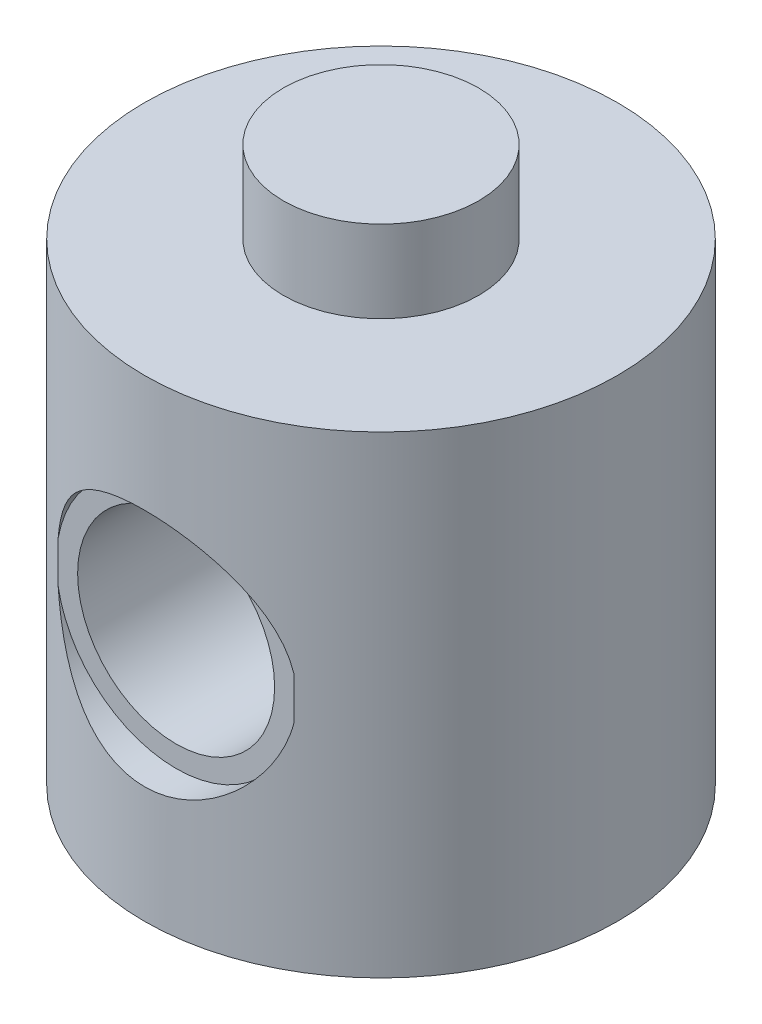
ISO-10303-21;
HEADER;
FILE_DESCRIPTION(('STEP AP214'),'2;1');
FILE_NAME('part.step','',(''),(''),'','','');
FILE_SCHEMA(('AUTOMOTIVE_DESIGN { 1 0 10303 214 1 1 1 1 }'));
ENDSEC;
DATA;
#1=APPLICATION_CONTEXT('core data for automotive mechanical design processes');
#2=APPLICATION_PROTOCOL_DEFINITION('international standard','automotive_design',2000,#1);
#3=PRODUCT_CONTEXT('',#1,'mechanical');
#4=PRODUCT('Part','Part','',(#3));
#5=PRODUCT_RELATED_PRODUCT_CATEGORY('part','',(#4));
#6=PRODUCT_DEFINITION_FORMATION('','',#4);
#7=PRODUCT_DEFINITION_CONTEXT('part definition',#1,'design');
#8=PRODUCT_DEFINITION('design','',#6,#7);
#9=PRODUCT_DEFINITION_SHAPE('','',#8);
#10=(LENGTH_UNIT() NAMED_UNIT(*) SI_UNIT(.MILLI.,.METRE.));
#11=(NAMED_UNIT(*) PLANE_ANGLE_UNIT() SI_UNIT($,.RADIAN.));
#12=(NAMED_UNIT(*) SI_UNIT($,.STERADIAN.) SOLID_ANGLE_UNIT());
#13=UNCERTAINTY_MEASURE_WITH_UNIT(LENGTH_MEASURE(1.E-05),#10,'distance_accuracy_value','');
#14=(GEOMETRIC_REPRESENTATION_CONTEXT(3) GLOBAL_UNCERTAINTY_ASSIGNED_CONTEXT((#13)) GLOBAL_UNIT_ASSIGNED_CONTEXT((#10,
#11,#12)) REPRESENTATION_CONTEXT('',''));
#15=CARTESIAN_POINT('',(0.,0.,0.));
#16=DIRECTION('',(0.,0.,1.));
#17=DIRECTION('',(1.,0.,0.));
#18=AXIS2_PLACEMENT_3D('',#15,#16,#17);
#19=CARTESIAN_POINT('',(0.,0.,0.));
#20=DIRECTION('',(0.,1.,0.));
#21=DIRECTION('',(0.,0.,1.));
#22=AXIS2_PLACEMENT_3D('',#19,#20,#21);
#23=PLANE('',#22);
#24=CARTESIAN_POINT('',(0.,0.,0.));
#25=DIRECTION('',(0.,-1.,0.));
#26=DIRECTION('',(0.,0.,-1.));
#27=AXIS2_PLACEMENT_3D('',#24,#25,#26);
#28=CIRCLE('',#27,3.937);
#29=CARTESIAN_POINT('',(0.,0.,-3.937));
#30=VERTEX_POINT('',#29);
#31=EDGE_CURVE('E97',#30,#30,#28,.T.);
#32=ORIENTED_EDGE('',*,*,#31,.F.);
#33=EDGE_LOOP('',(#32));
#34=FACE_BOUND('',#33,.T.);
#35=ADVANCED_FACE('F35',(#34),#23,.T.);
#36=CARTESIAN_POINT('',(0.,-25.654,0.));
#37=DIRECTION('',(0.,-1.,0.));
#38=DIRECTION('',(0.,0.,-1.));
#39=AXIS2_PLACEMENT_3D('',#36,#37,#38);
#40=CYLINDRICAL_SURFACE('',#39,3.937);
#41=ORIENTED_EDGE('',*,*,#31,.T.);
#42=EDGE_LOOP('',(#41));
#43=FACE_BOUND('',#42,.T.);
#44=CARTESIAN_POINT('',(0.,-3.302,0.));
#45=DIRECTION('',(0.,-1.,0.));
#46=DIRECTION('',(0.,0.,-1.));
#47=AXIS2_PLACEMENT_3D('',#44,#45,#46);
#48=CIRCLE('',#47,3.937);
#49=CARTESIAN_POINT('',(0.,-3.302,-3.937));
#50=VERTEX_POINT('',#49);
#51=EDGE_CURVE('E94',#50,#50,#48,.T.);
#52=ORIENTED_EDGE('',*,*,#51,.F.);
#53=EDGE_LOOP('',(#52));
#54=FACE_BOUND('',#53,.T.);
#55=ADVANCED_FACE('F134',(#43,#54),#40,.T.);
#56=CARTESIAN_POINT('',(3.937,-3.302,0.));
#57=DIRECTION('',(0.,1.,0.));
#58=DIRECTION('',(0.,0.,1.));
#59=AXIS2_PLACEMENT_3D('',#56,#57,#58);
#60=PLANE('',#59);
#61=ORIENTED_EDGE('',*,*,#51,.T.);
#62=EDGE_LOOP('',(#61));
#63=FACE_BOUND('',#62,.T.);
#64=CARTESIAN_POINT('',(0.,-3.30199999999999,0.));
#65=DIRECTION('',(0.,-1.,0.));
#66=DIRECTION('',(0.,0.,-1.));
#67=AXIS2_PLACEMENT_3D('',#64,#65,#66);
#68=CIRCLE('',#67,9.525);
#69=CARTESIAN_POINT('',(0.,-3.30199999999999,-9.525));
#70=VERTEX_POINT('',#69);
#71=EDGE_CURVE('E91',#70,#70,#68,.T.);
#72=ORIENTED_EDGE('',*,*,#71,.F.);
#73=EDGE_LOOP('',(#72));
#74=FACE_BOUND('',#73,.T.);
#75=ADVANCED_FACE('F130',(#63,#74),#60,.T.);
#76=CARTESIAN_POINT('',(0.,-25.654,0.));
#77=DIRECTION('',(0.,-1.,0.));
#78=DIRECTION('',(0.,0.,-1.));
#79=AXIS2_PLACEMENT_3D('',#76,#77,#78);
#80=CYLINDRICAL_SURFACE('',#79,9.525);
#81=CARTESIAN_POINT('',(0.,-8.85825,-9.525));
#82=CARTESIAN_POINT('',(0.10633970411079,-8.85825075579918,-9.52499940431026));
#83=CARTESIAN_POINT('',(0.212715681361909,-8.86252998663664,-9.52321418687749));
#84=CARTESIAN_POINT('',(0.424708606879246,-8.87960572355877,-9.51611852971387));
#85=CARTESIAN_POINT('',(0.530325032060798,-8.89240761932245,-9.51080585924981));
#86=CARTESIAN_POINT('',(0.74019608530889,-8.92643556289711,-9.49677884054498));
#87=CARTESIAN_POINT('',(0.844447466681659,-8.9476788784387,-9.48805752018966));
#88=CARTESIAN_POINT('',(1.05063078746721,-8.99836518775707,-9.46744770745331));
#89=CARTESIAN_POINT('',(1.15256176045451,-9.02781153278659,-9.45555792071836));
#90=CARTESIAN_POINT('',(1.45304856102099,-9.12781375637483,-9.41566954873609));
#91=CARTESIAN_POINT('',(1.64725042578752,-9.21018971375427,-9.38338421186795));
#92=CARTESIAN_POINT('',(2.01878960760281,-9.4036358094224,-9.31053593336086));
#93=CARTESIAN_POINT('',(2.1961320108023,-9.51469725607151,-9.2699754998386));
#94=CARTESIAN_POINT('',(2.53824093920422,-9.76829760976836,-9.18234884286996));
#95=CARTESIAN_POINT('',(2.70205730367417,-9.91204683134421,-9.13506952420801));
#96=CARTESIAN_POINT('',(3.00405615198817,-10.224329081658,-9.04026456603983));
#97=CARTESIAN_POINT('',(3.14222513903647,-10.3928750764095,-8.99273881029334));
#98=CARTESIAN_POINT('',(3.39579467666476,-10.7602021391387,-8.9001883806779));
#99=CARTESIAN_POINT('',(3.50974047292495,-10.9600628172753,-8.85540182052122));
#100=CARTESIAN_POINT('',(3.65386256626164,-11.2734408877733,-8.79645372122563));
#101=CARTESIAN_POINT('',(3.69744892615389,-11.3802090358061,-8.7781707903278));
#102=CARTESIAN_POINT('',(3.77528941119493,-11.5975831962278,-8.74497623698359));
#103=CARTESIAN_POINT('',(3.80954833407463,-11.708187202443,-8.73006288201086));
#104=CARTESIAN_POINT('',(3.86694170240057,-11.9270416665505,-8.70478736192303));
#105=CARTESIAN_POINT('',(3.89052895323577,-12.0351526105931,-8.6942419907478));
#106=CARTESIAN_POINT('',(3.92861373354644,-12.2532288849286,-8.67709957077971));
#107=CARTESIAN_POINT('',(3.94311546377091,-12.3631933340546,-8.67050069736239));
#108=CARTESIAN_POINT('',(3.9628609387512,-12.5840935887695,-8.66149391151972));
#109=CARTESIAN_POINT('',(3.96810707162349,-12.6950291363707,-8.6590849180296));
#110=CARTESIAN_POINT('',(3.96928172781074,-12.9169554305756,-8.65854653232213));
#111=CARTESIAN_POINT('',(3.96521074158956,-13.0279461739662,-8.6604169148335));
#112=CARTESIAN_POINT('',(3.94847322291751,-13.2405337470504,-8.66805984388474));
#113=CARTESIAN_POINT('',(3.93649226790049,-13.3421961914464,-8.67352102353332));
#114=CARTESIAN_POINT('',(3.90477208316463,-13.5440698663892,-8.68784624326788));
#115=CARTESIAN_POINT('',(3.8850303162509,-13.6442806112205,-8.69671139617201));
#116=CARTESIAN_POINT('',(3.81443477338007,-13.941666939379,-8.72802607625492));
#117=CARTESIAN_POINT('',(3.75219655480152,-14.1357725253334,-8.75520186013044));
#118=CARTESIAN_POINT('',(3.59796791715169,-14.5147272003309,-8.81971157431981));
#119=CARTESIAN_POINT('',(3.50537257326443,-14.6992914243909,-8.85724935772168));
#120=CARTESIAN_POINT('',(3.29346810049256,-15.0510083387365,-8.93820695787082));
#121=CARTESIAN_POINT('',(3.17414843672174,-15.2181541243908,-8.98162909159069));
#122=CARTESIAN_POINT('',(2.90034934429311,-15.5451199217075,-9.07392703271809));
#123=CARTESIAN_POINT('',(2.74375071631135,-15.7031270360366,-9.12295360910874));
#124=CARTESIAN_POINT('',(2.40579154448283,-15.9912471871474,-9.21784011680502));
#125=CARTESIAN_POINT('',(2.22442521639882,-16.1213536897357,-9.26369930462193));
#126=CARTESIAN_POINT('',(1.83657221137101,-16.3526339296476,-9.34841550416938));
#127=CARTESIAN_POINT('',(1.62960234239378,-16.4530705390501,-9.38708646308533));
#128=CARTESIAN_POINT('',(1.1996813848965,-16.6170645675717,-9.45164103458571));
#129=CARTESIAN_POINT('',(0.97673920525985,-16.6806423682592,-9.47753171301731));
#130=CARTESIAN_POINT('',(0.536346758201596,-16.765320787332,-9.51228860774907));
#131=CARTESIAN_POINT('',(0.319440830312391,-16.7888534506816,-9.52212792826799));
#132=CARTESIAN_POINT('',(-0.115426030752912,-16.800024256678,-9.52677959918588));
#133=CARTESIAN_POINT('',(-0.33338664309293,-16.7876727046877,-9.52159626384832));
#134=CARTESIAN_POINT('',(-0.752786919544944,-16.7291668065603,-9.4974161606133));
#135=CARTESIAN_POINT('',(-0.954509669108727,-16.6847203959607,-9.4791176712683));
#136=CARTESIAN_POINT('',(-1.34741522795452,-16.5656634821137,-9.43129326502253));
#137=CARTESIAN_POINT('',(-1.53859670219197,-16.4910491680502,-9.40176592971954));
#138=CARTESIAN_POINT('',(-1.91169607458844,-16.3113371521734,-9.33317509298509));
#139=CARTESIAN_POINT('',(-2.09314172700115,-16.2053645185194,-9.29384385415236));
#140=CARTESIAN_POINT('',(-2.43632423654929,-15.9669055255033,-9.20984329538344));
#141=CARTESIAN_POINT('',(-2.59805281957313,-15.8344080964218,-9.16517174989766));
#142=CARTESIAN_POINT('',(-2.90935864105438,-15.5355822343309,-9.07135879069044));
#143=CARTESIAN_POINT('',(-3.05724146582753,-15.3675127528885,-9.02212608805477));
#144=CARTESIAN_POINT('',(-3.32317676164348,-15.0081574490353,-8.92760269234456));
#145=CARTESIAN_POINT('',(-3.44122245828601,-14.8168663688213,-8.88231289601852));
#146=CARTESIAN_POINT('',(-3.64540673564474,-14.4125499929158,-8.80050901339689));
#147=CARTESIAN_POINT('',(-3.73106690034734,-14.199253935366,-8.76412911168939));
#148=CARTESIAN_POINT('',(-3.86452789664723,-13.7592733665258,-8.70611529160776));
#149=CARTESIAN_POINT('',(-3.91235994567535,-13.5326000611061,-8.68446921628956));
#150=CARTESIAN_POINT('',(-3.965704538383,-13.0911006235899,-8.66023047600162));
#151=CARTESIAN_POINT('',(-3.97419128243222,-12.8767056739996,-8.65629940020154));
#152=CARTESIAN_POINT('',(-3.95654456856182,-12.4496739390948,-8.66437982610697));
#153=CARTESIAN_POINT('',(-3.93041642538564,-12.2370368889174,-8.67638888037757));
#154=CARTESIAN_POINT('',(-3.84677918968912,-11.8297554443957,-8.71377327866253));
#155=CARTESIAN_POINT('',(-3.79078759664358,-11.6347342609689,-8.73850035697026));
#156=CARTESIAN_POINT('',(-3.6504990123346,-11.2568103330602,-8.79802591245428));
#157=CARTESIAN_POINT('',(-3.56619406749029,-11.0739110110688,-8.83282721922989));
#158=CARTESIAN_POINT('',(-3.36582424000277,-10.7134143417355,-8.91117616528712));
#159=CARTESIAN_POINT('',(-3.2481544891375,-10.5367970424104,-8.95512388439339));
#160=CARTESIAN_POINT('',(-2.98668090348688,-10.2048986184185,-9.04569075374843));
#161=CARTESIAN_POINT('',(-2.84286800697564,-10.0496249247388,-9.09231082643892));
#162=CARTESIAN_POINT('',(-2.52060299354102,-9.75310963604892,-9.18707098471589));
#163=CARTESIAN_POINT('',(-2.34039087540218,-9.61371371114321,-9.23507447466899));
#164=CARTESIAN_POINT('',(-2.05338852131443,-9.42882507950686,-9.30155622819451));
#165=CARTESIAN_POINT('',(-1.95485248361421,-9.37119234617727,-9.32281142897058));
#166=CARTESIAN_POINT('',(-1.75280765547819,-9.26446293706479,-9.36289852055438));
#167=CARTESIAN_POINT('',(-1.64930118613717,-9.21536232548364,-9.38173152765293));
#168=CARTESIAN_POINT('',(-1.43970220933928,-9.1268685688241,-9.41615560801287));
#169=CARTESIAN_POINT('',(-1.33367770464092,-9.08733249688213,-9.43179378843127));
#170=CARTESIAN_POINT('',(-1.11828343863684,-9.01737662191413,-9.4597489373536));
#171=CARTESIAN_POINT('',(-1.0089152912531,-8.98695249493741,-9.47206748086749));
#172=CARTESIAN_POINT('',(-0.787917389017955,-8.93559882840211,-9.49300284455448));
#173=CARTESIAN_POINT('',(-0.676293942040776,-8.91464584135328,-9.50162880353856));
#174=CARTESIAN_POINT('',(-0.451486990346158,-8.882381685939,-9.51495896057856));
#175=CARTESIAN_POINT('',(-0.338304692950855,-8.8710634400495,-9.51966603732563));
#176=CARTESIAN_POINT('',(-0.187413035354008,-8.86249991936782,-9.52322990511202));
#177=CARTESIAN_POINT('',(-0.149952710192017,-8.86090663475635,-9.52389333055184));
#178=CARTESIAN_POINT('',(-0.0749964270699467,-8.85878154028714,-9.52477848366261));
#179=CARTESIAN_POINT('',(-0.0375004690081364,-8.85824973346904,-9.52500021006871));
#180=CARTESIAN_POINT('',(0.,-8.85825,-9.525));
#181=B_SPLINE_CURVE_WITH_KNOTS('',3,(#81,#82,#83,#84,#85,#86,#87,#88,#89,#90,#91,#92,#93,#94,
#95,#96,#97,#98,#99,#100,#101,#102,#103,#104,#105,#106,#107,#108,#109,#110,#111,#112,#113,#114,
#115,#116,#117,#118,#119,#120,#121,#122,#123,#124,#125,#126,#127,#128,#129,#130,#131,#132,#133,
#134,#135,#136,#137,#138,#139,#140,#141,#142,#143,#144,#145,#146,#147,#148,#149,#150,#151,#152,
#153,#154,#155,#156,#157,#158,#159,#160,#161,#162,#163,#164,#165,#166,#167,#168,#169,#170,#171,
#172,#173,#174,#175,#176,#177,#178,#179,#180),.UNSPECIFIED.,.T.,.F.,(4,2,2,2,2,2,2,2,2,2,2,2,2,
2,2,2,2,2,2,2,2,2,2,2,2,2,2,2,2,2,2,2,2,2,2,2,2,2,2,2,2,2,2,2,2,2,2,2,2,4),(0.,
0.318980749509823,0.638163412276113,0.958002382820616,1.27797221198539,1.91504647529178,
2.55192793249747,3.21802682265889,3.8844752561633,4.5837145996065,4.93360722716024,
5.28331953982211,5.61634537556024,5.9492171208044,6.28200296637181,6.61477129411296,
6.92193148931367,7.22919218614456,7.84319027634679,8.47025383462197,9.09756502152909,
9.7778911758185,10.458376485746,11.1545684431886,11.8503750639387,12.5021777727435,
13.153793312916,13.7730714191169,14.3924277771145,15.0310237398989,15.6698867686643,
16.3544066899379,17.0390818893886,17.7335092254226,18.4273628896257,19.0678058075265,
19.7081504037046,20.318685081389,20.9293914096897,21.5768183103765,22.2244700512815,
22.919292181413,23.2672758934175,23.6150986547656,23.9573486775528,24.2994360319326,
24.6406717865072,24.9816566580067,25.0941442143458,25.2066320928029),.UNSPECIFIED.);
#182=CARTESIAN_POINT('',(0.,-8.85825,-9.525));
#183=VERTEX_POINT('',#182);
#184=EDGE_CURVE('E11',#183,#183,#181,.T.);
#185=ORIENTED_EDGE('',*,*,#184,.F.);
#186=EDGE_LOOP('',(#185));
#187=FACE_BOUND('',#186,.T.);
#188=CARTESIAN_POINT('',(4.75190488120291,-11.9845773032497,8.255));
#189=CARTESIAN_POINT('',(4.72855649021731,-11.8527776350593,8.26842088191353));
#190=CARTESIAN_POINT('',(4.69975478500802,-11.7223071168015,8.28488808991296));
#191=CARTESIAN_POINT('',(4.63173162514788,-11.4650219549602,8.32311784951479));
#192=CARTESIAN_POINT('',(4.59251920791737,-11.3382042457534,8.34487580690663));
#193=CARTESIAN_POINT('',(4.50431765081452,-11.0895497278029,8.39280800779824));
#194=CARTESIAN_POINT('',(4.45537312691393,-10.967693138807,8.41896201633006));
#195=CARTESIAN_POINT('',(4.34810525834331,-10.7290512051058,8.47486136182834));
#196=CARTESIAN_POINT('',(4.28977993418078,-10.6122669373585,8.50460745644913));
#197=CARTESIAN_POINT('',(4.10183942651847,-10.2711531163778,8.59767356954532));
#198=CARTESIAN_POINT('',(3.95890529879593,-10.0550750916126,8.66502414267079));
#199=CARTESIAN_POINT('',(3.64104748193096,-9.64898185117936,8.80332489032132));
#200=CARTESIAN_POINT('',(3.46607493523725,-9.45900722759659,8.87428044125788));
#201=CARTESIAN_POINT('',(3.07211151872707,-9.0947384675056,9.0185908764812));
#202=CARTESIAN_POINT('',(2.85072770705037,-8.92288979186011,9.09168840416898));
#203=CARTESIAN_POINT('',(2.4972902530365,-8.69498526235921,9.19262154714426));
#204=CARTESIAN_POINT('',(2.37586700082117,-8.6239737502989,9.22482437313801));
#205=CARTESIAN_POINT('',(2.12656166498271,-8.49250669517395,9.28546023173191));
#206=CARTESIAN_POINT('',(1.9986829550413,-8.43204571045272,9.31389520584885));
#207=CARTESIAN_POINT('',(1.74116937444989,-8.32394183739091,9.3653986639104));
#208=CARTESIAN_POINT('',(1.61169790764647,-8.27597312260344,9.38860083689935));
#209=CARTESIAN_POINT('',(1.34844437199551,-8.19115245270735,9.43000850855167));
#210=CARTESIAN_POINT('',(1.21466445175274,-8.15429504862392,9.44821645598161));
#211=CARTESIAN_POINT('',(0.943870120041347,-8.09216369365759,9.47909789552248));
#212=CARTESIAN_POINT('',(0.806857106782726,-8.06688482857868,9.49177373547805));
#213=CARTESIAN_POINT('',(0.530749118461877,-8.02824946531402,9.51120786183602));
#214=CARTESIAN_POINT('',(0.39165436011805,-8.01489173474626,9.51796675991814));
#215=CARTESIAN_POINT('',(0.127007436312933,-8.00104319126578,9.52497663423949));
#216=CARTESIAN_POINT('',(0.00153115960122802,-7.99937207615102,9.525824563413));
#217=CARTESIAN_POINT('',(-0.249149923883757,-8.00580473406054,9.52256604963356));
#218=CARTESIAN_POINT('',(-0.374354630065958,-8.01391165942998,9.51845800892402));
#219=CARTESIAN_POINT('',(-0.623440516731692,-8.03980142567699,9.50539293796704));
#220=CARTESIAN_POINT('',(-0.747322292225341,-8.05757971217846,9.49643819011027));
#221=CARTESIAN_POINT('',(-0.992968857663767,-8.10260700140066,9.473904103008));
#222=CARTESIAN_POINT('',(-1.11473282241951,-8.12985961259801,9.46032300176765));
#223=CARTESIAN_POINT('',(-1.35204299403428,-8.1926811033314,9.42929128389831));
#224=CARTESIAN_POINT('',(-1.46766837506096,-8.22800734460007,9.41195421334528));
#225=CARTESIAN_POINT('',(-1.69542171495095,-8.30700339700673,9.3736083574275));
#226=CARTESIAN_POINT('',(-1.80754844627791,-8.35067609912968,9.35259830005653));
#227=CARTESIAN_POINT('',(-2.13768164199204,-8.49363924618295,9.2847330980744));
#228=CARTESIAN_POINT('',(-2.34962924923058,-8.60492512467473,9.23301722970428));
#229=CARTESIAN_POINT('',(-2.76865513346666,-8.86588370697216,9.11653157837701));
#230=CARTESIAN_POINT('',(-2.9740932505601,-9.01785723312234,9.051062106797));
#231=CARTESIAN_POINT('',(-3.35792873986696,-9.35146008832329,8.9157962059555));
#232=CARTESIAN_POINT('',(-3.53629552629793,-9.53312248648399,8.84599500617439));
#233=CARTESIAN_POINT('',(-3.87810058570494,-9.94120248863569,8.70192525556126));
#234=CARTESIAN_POINT('',(-4.03855915329378,-10.1702219953179,8.62785360432333));
#235=CARTESIAN_POINT('',(-4.24841259377144,-10.5333514796331,8.52541473337));
#236=CARTESIAN_POINT('',(-4.31319882039389,-10.6575912125947,8.49272805227595));
#237=CARTESIAN_POINT('',(-4.43202359653443,-10.9120252473136,8.43132538939048));
#238=CARTESIAN_POINT('',(-4.48606763187856,-11.0422164677638,8.40260738317011));
#239=CARTESIAN_POINT('',(-4.58202370983602,-11.3056031013078,8.35066749171713));
#240=CARTESIAN_POINT('',(-4.62411752722766,-11.4387160822289,8.32736436126597));
#241=CARTESIAN_POINT('',(-4.69678583578998,-11.7089191191492,8.28658340815691));
#242=CARTESIAN_POINT('',(-4.72735962006918,-11.8460094186487,8.26910594298069));
#243=CARTESIAN_POINT('',(-4.75190488120291,-11.9845773032498,8.255));
#244=B_SPLINE_CURVE_WITH_KNOTS('',3,(#188,#189,#190,#191,#192,#193,#194,#195,#196,#197,#198,
#199,#200,#201,#202,#203,#204,#205,#206,#207,#208,#209,#210,#211,#212,#213,#214,#215,#216,#217,
#218,#219,#220,#221,#222,#223,#224,#225,#226,#227,#228,#229,#230,#231,#232,#233,#234,#235,#236,
#237,#238,#239,#240,#241,#242,#243),.UNSPECIFIED.,.F.,.F.,(4,2,2,2,2,2,2,2,2,2,2,2,2,2,2,2,2,2,
2,2,2,2,2,2,2,2,2,4),(0.,0.403342037857074,0.806335077484744,1.20752154464057,1.6087927796218,
2.40816792564716,3.20877240191399,4.07299308753501,4.50543399475259,4.93765119795929,
5.35710356401702,5.77634989521542,6.19541812345234,6.61444302427057,6.99044410026824,
7.36656642776391,7.74251178724889,8.11860048982206,8.48460276996207,8.85073205376495,
9.58240782321379,10.3705898572314,11.159655871641,12.0229002166055,12.4540713597343,
12.8850217432905,13.309014809243,13.7330338879939),.UNSPECIFIED.);
#245=CARTESIAN_POINT('',(4.75190488120291,-11.9845773032497,8.255));
#246=VERTEX_POINT('',#245);
#247=CARTESIAN_POINT('',(-4.75190488120291,-11.9845773032498,8.255));
#248=VERTEX_POINT('',#247);
#249=EDGE_CURVE('E66',#246,#248,#244,.T.);
#250=ORIENTED_EDGE('',*,*,#249,.F.);
#251=DIRECTION('',(0.,-1.,0.));
#252=VECTOR('',#251,1.);
#253=CARTESIAN_POINT('',(4.75190488120291,-25.654,8.255));
#254=LINE('',#253,#252);
#255=CARTESIAN_POINT('',(4.75190488120291,-13.6694226967502,8.255));
#256=VERTEX_POINT('',#255);
#257=EDGE_CURVE('E69',#246,#256,#254,.T.);
#258=ORIENTED_EDGE('',*,*,#257,.T.);
#259=CARTESIAN_POINT('',(-4.75190488120291,-13.6694226967502,8.255));
#260=CARTESIAN_POINT('',(-4.7285564902173,-13.8012223649406,8.26842088191353));
#261=CARTESIAN_POINT('',(-4.69975478500802,-13.9316928831985,8.28488808991296));
#262=CARTESIAN_POINT('',(-4.63173162514789,-14.1889780450397,8.32311784951479));
#263=CARTESIAN_POINT('',(-4.59251920791738,-14.3157957542465,8.34487580690663));
#264=CARTESIAN_POINT('',(-4.50431765081453,-14.564450272197,8.39280800779824));
#265=CARTESIAN_POINT('',(-4.45537312691393,-14.686306861193,8.41896201633005));
#266=CARTESIAN_POINT('',(-4.34810525834332,-14.9249487948942,8.47486136182834));
#267=CARTESIAN_POINT('',(-4.28977993418079,-15.0417330626415,8.50460745644912));
#268=CARTESIAN_POINT('',(-4.10183942651848,-15.3828468836222,8.59767356954531));
#269=CARTESIAN_POINT('',(-3.95890529879594,-15.5989249083874,8.66502414267078));
#270=CARTESIAN_POINT('',(-3.64104748193098,-16.0050181488206,8.80332489032132));
#271=CARTESIAN_POINT('',(-3.46607493523727,-16.1949927724034,8.87428044125787));
#272=CARTESIAN_POINT('',(-3.07211151872709,-16.5592615324944,9.0185908764812));
#273=CARTESIAN_POINT('',(-2.85072770705039,-16.7311102081399,9.09168840416897));
#274=CARTESIAN_POINT('',(-2.49729025303653,-16.9590147376408,9.19262154714425));
#275=CARTESIAN_POINT('',(-2.3758670008212,-17.0300262497011,9.224824373138));
#276=CARTESIAN_POINT('',(-2.12656166498273,-17.161493304826,9.2854602317319));
#277=CARTESIAN_POINT('',(-1.99868295504133,-17.2219542895473,9.31389520584885));
#278=CARTESIAN_POINT('',(-1.74116937444992,-17.3300581626091,9.3653986639104));
#279=CARTESIAN_POINT('',(-1.61169790764649,-17.3780268773965,9.38860083689935));
#280=CARTESIAN_POINT('',(-1.34844437199554,-17.4628475472926,9.43000850855167));
#281=CARTESIAN_POINT('',(-1.21466445175276,-17.4997049513761,9.4482164559816));
#282=CARTESIAN_POINT('',(-0.943870120041372,-17.5618363063424,9.47909789552248));
#283=CARTESIAN_POINT('',(-0.806857106782752,-17.5871151714213,9.49177373547805));
#284=CARTESIAN_POINT('',(-0.530749118461903,-17.625750534686,9.51120786183602));
#285=CARTESIAN_POINT('',(-0.391654360118076,-17.6391082652537,9.51796675991814));
#286=CARTESIAN_POINT('',(-0.127007436312958,-17.6529568087342,9.52497663423949));
#287=CARTESIAN_POINT('',(-0.00153115960125293,-17.654627923849,9.525824563413));
#288=CARTESIAN_POINT('',(0.249149923883732,-17.6481952659395,9.52256604963356));
#289=CARTESIAN_POINT('',(0.374354630065934,-17.64008834057,9.51845800892402));
#290=CARTESIAN_POINT('',(0.623440516731669,-17.614198574323,9.50539293796704));
#291=CARTESIAN_POINT('',(0.747322292225318,-17.5964202878215,9.49643819011027));
#292=CARTESIAN_POINT('',(0.992968857663745,-17.5513929985993,9.473904103008));
#293=CARTESIAN_POINT('',(1.11473282241949,-17.524140387402,9.46032300176765));
#294=CARTESIAN_POINT('',(1.35204299403426,-17.4613188966686,9.42929128389831));
#295=CARTESIAN_POINT('',(1.46766837506094,-17.4259926553999,9.41195421334528));
#296=CARTESIAN_POINT('',(1.69542171495093,-17.3469966029933,9.3736083574275));
#297=CARTESIAN_POINT('',(1.80754844627789,-17.3033239008703,9.35259830005654));
#298=CARTESIAN_POINT('',(2.13768164199202,-17.1603607538171,9.28473309807441));
#299=CARTESIAN_POINT('',(2.34962924923056,-17.0490748753253,9.23301722970429));
#300=CARTESIAN_POINT('',(2.76865513346664,-16.7881162930279,9.11653157837701));
#301=CARTESIAN_POINT('',(2.97409325056008,-16.6361427668777,9.05106210679701));
#302=CARTESIAN_POINT('',(3.35792873986694,-16.3025399116767,8.91579620595551));
#303=CARTESIAN_POINT('',(3.53629552629792,-16.120877513516,8.84599500617439));
#304=CARTESIAN_POINT('',(3.87810058570493,-15.7127975113643,8.70192525556127));
#305=CARTESIAN_POINT('',(4.03855915329376,-15.4837780046821,8.62785360432334));
#306=CARTESIAN_POINT('',(4.24841259377142,-15.1206485203669,8.52541473337));
#307=CARTESIAN_POINT('',(4.31319882039388,-14.9964087874054,8.49272805227596));
#308=CARTESIAN_POINT('',(4.43202359653442,-14.7419747526864,8.43132538939049));
#309=CARTESIAN_POINT('',(4.48606763187855,-14.6117835322362,8.40260738317011));
#310=CARTESIAN_POINT('',(4.58202370983601,-14.3483968986922,8.35066749171713));
#311=CARTESIAN_POINT('',(4.62411752722766,-14.2152839177711,8.32736436126597));
#312=CARTESIAN_POINT('',(4.69678583578998,-13.9450808808508,8.28658340815692));
#313=CARTESIAN_POINT('',(4.72735962006918,-13.8079905813513,8.26910594298069));
#314=CARTESIAN_POINT('',(4.75190488120291,-13.6694226967502,8.255));
#315=B_SPLINE_CURVE_WITH_KNOTS('',3,(#259,#260,#261,#262,#263,#264,#265,#266,#267,#268,#269,
#270,#271,#272,#273,#274,#275,#276,#277,#278,#279,#280,#281,#282,#283,#284,#285,#286,#287,#288,
#289,#290,#291,#292,#293,#294,#295,#296,#297,#298,#299,#300,#301,#302,#303,#304,#305,#306,#307,
#308,#309,#310,#311,#312,#313,#314),.UNSPECIFIED.,.F.,.F.,(4,2,2,2,2,2,2,2,2,2,2,2,2,2,2,2,2,2,
2,2,2,2,2,2,2,2,2,4),(0.,0.403342037857074,0.806335077484745,1.20752154464056,1.6087927796218,
2.40816792564715,3.20877240191399,4.072993087535,4.50543399475258,4.93765119795928,
5.357103564017,5.77634989521541,6.19541812345233,6.61444302427056,6.99044410026823,
7.3665664277639,7.74251178724888,8.11860048982205,8.48460276996207,8.85073205376495,
9.58240782321379,10.3705898572314,11.159655871641,12.0229002166054,12.4540713597343,
12.8850217432905,13.309014809243,13.7330338879939),.UNSPECIFIED.);
#316=CARTESIAN_POINT('',(-4.75190488120291,-13.6694226967502,8.255));
#317=VERTEX_POINT('',#316);
#318=EDGE_CURVE('E60',#317,#256,#315,.T.);
#319=ORIENTED_EDGE('',*,*,#318,.F.);
#320=DIRECTION('',(0.,-1.,0.));
#321=VECTOR('',#320,1.);
#322=CARTESIAN_POINT('',(-4.75190488120291,-25.654,8.255));
#323=LINE('',#322,#321);
#324=EDGE_CURVE('E46',#317,#248,#323,.F.);
#325=ORIENTED_EDGE('',*,*,#324,.T.);
#326=EDGE_LOOP('',(#250,#258,#319,#325));
#327=FACE_BOUND('',#326,.T.);
#328=ORIENTED_EDGE('',*,*,#71,.T.);
#329=EDGE_LOOP('',(#328));
#330=FACE_BOUND('',#329,.T.);
#331=CARTESIAN_POINT('',(0.,-22.352,0.));
#332=DIRECTION('',(0.,-1.,0.));
#333=DIRECTION('',(0.,0.,-1.));
#334=AXIS2_PLACEMENT_3D('',#331,#332,#333);
#335=CIRCLE('',#334,9.525);
#336=CARTESIAN_POINT('',(0.,-22.352,-9.525));
#337=VERTEX_POINT('',#336);
#338=EDGE_CURVE('E88',#337,#337,#335,.T.);
#339=ORIENTED_EDGE('',*,*,#338,.F.);
#340=EDGE_LOOP('',(#339));
#341=FACE_BOUND('',#340,.T.);
#342=ADVANCED_FACE('F67',(#187,#327,#330,#341),#80,.T.);
#343=CARTESIAN_POINT('',(9.525,-22.352,0.));
#344=DIRECTION('',(0.,-1.,0.));
#345=DIRECTION('',(0.,0.,-1.));
#346=AXIS2_PLACEMENT_3D('',#343,#344,#345);
#347=PLANE('',#346);
#348=ORIENTED_EDGE('',*,*,#338,.T.);
#349=EDGE_LOOP('',(#348));
#350=FACE_BOUND('',#349,.T.);
#351=CARTESIAN_POINT('',(0.,-22.352,0.));
#352=DIRECTION('',(0.,-1.,0.));
#353=DIRECTION('',(0.,0.,-1.));
#354=AXIS2_PLACEMENT_3D('',#351,#352,#353);
#355=CIRCLE('',#354,3.937);
#356=CARTESIAN_POINT('',(0.,-22.352,-3.937));
#357=VERTEX_POINT('',#356);
#358=EDGE_CURVE('E81',#357,#357,#355,.T.);
#359=ORIENTED_EDGE('',*,*,#358,.F.);
#360=EDGE_LOOP('',(#359));
#361=FACE_BOUND('',#360,.T.);
#362=ADVANCED_FACE('F123',(#350,#361),#347,.T.);
#363=CARTESIAN_POINT('',(0.,-25.654,0.));
#364=DIRECTION('',(0.,-1.,0.));
#365=DIRECTION('',(0.,0.,-1.));
#366=AXIS2_PLACEMENT_3D('',#363,#364,#365);
#367=CYLINDRICAL_SURFACE('',#366,3.937);
#368=ORIENTED_EDGE('',*,*,#358,.T.);
#369=EDGE_LOOP('',(#368));
#370=FACE_BOUND('',#369,.T.);
#371=CARTESIAN_POINT('',(0.,-25.654,0.));
#372=DIRECTION('',(0.,-1.,0.));
#373=DIRECTION('',(0.,0.,-1.));
#374=AXIS2_PLACEMENT_3D('',#371,#372,#373);
#375=CIRCLE('',#374,3.937);
#376=CARTESIAN_POINT('',(0.,-25.654,-3.937));
#377=VERTEX_POINT('',#376);
#378=EDGE_CURVE('E78',#377,#377,#375,.T.);
#379=ORIENTED_EDGE('',*,*,#378,.F.);
#380=EDGE_LOOP('',(#379));
#381=FACE_BOUND('',#380,.T.);
#382=ADVANCED_FACE('F120',(#370,#381),#367,.T.);
#383=CARTESIAN_POINT('',(3.937,-25.654,0.));
#384=DIRECTION('',(0.,-1.,0.));
#385=DIRECTION('',(0.,0.,-1.));
#386=AXIS2_PLACEMENT_3D('',#383,#384,#385);
#387=PLANE('',#386);
#388=ORIENTED_EDGE('',*,*,#378,.T.);
#389=EDGE_LOOP('',(#388));
#390=FACE_BOUND('',#389,.T.);
#391=ADVANCED_FACE('F116',(#390),#387,.T.);
#392=CARTESIAN_POINT('',(0.,-12.827,8.255));
#393=DIRECTION('',(0.,0.,1.));
#394=DIRECTION('',(1.,0.,0.));
#395=AXIS2_PLACEMENT_3D('',#392,#393,#394);
#396=CYLINDRICAL_SURFACE('',#395,4.826);
#397=CARTESIAN_POINT('',(0.,-12.827,8.255));
#398=DIRECTION('',(0.,0.,1.));
#399=DIRECTION('',(1.,0.,0.));
#400=AXIS2_PLACEMENT_3D('',#397,#398,#399);
#401=CIRCLE('',#400,4.826);
#402=EDGE_CURVE('E75',#246,#248,#401,.T.);
#403=ORIENTED_EDGE('',*,*,#402,.F.);
#404=ORIENTED_EDGE('',*,*,#249,.T.);
#405=EDGE_LOOP('',(#403,#404));
#406=FACE_BOUND('',#405,.T.);
#407=ADVANCED_FACE('F77',(#406),#396,.F.);
#408=EDGE_CURVE('E53',#317,#256,#401,.T.);
#409=ORIENTED_EDGE('',*,*,#408,.F.);
#410=ORIENTED_EDGE('',*,*,#318,.T.);
#411=EDGE_LOOP('',(#409,#410));
#412=FACE_BOUND('',#411,.T.);
#413=ADVANCED_FACE('F110',(#412),#396,.F.);
#414=CARTESIAN_POINT('',(0.,-12.827,8.255));
#415=DIRECTION('',(0.,0.,1.));
#416=DIRECTION('',(1.,0.,0.));
#417=AXIS2_PLACEMENT_3D('',#414,#415,#416);
#418=PLANE('',#417);
#419=CARTESIAN_POINT('',(0.,-12.827,8.255));
#420=DIRECTION('',(0.,0.,1.));
#421=DIRECTION('',(1.,0.,0.));
#422=AXIS2_PLACEMENT_3D('',#419,#420,#421);
#423=CIRCLE('',#422,3.96874999999999);
#424=CARTESIAN_POINT('',(3.96874999999999,-12.827,8.255));
#425=VERTEX_POINT('',#424);
#426=EDGE_CURVE('E83',#425,#425,#423,.T.);
#427=ORIENTED_EDGE('',*,*,#426,.F.);
#428=EDGE_LOOP('',(#427));
#429=FACE_BOUND('',#428,.T.);
#430=ORIENTED_EDGE('',*,*,#408,.T.);
#431=ORIENTED_EDGE('',*,*,#257,.F.);
#432=ORIENTED_EDGE('',*,*,#402,.T.);
#433=ORIENTED_EDGE('',*,*,#324,.F.);
#434=EDGE_LOOP('',(#430,#431,#432,#433));
#435=FACE_BOUND('',#434,.T.);
#436=ADVANCED_FACE('F74',(#429,#435),#418,.T.);
#437=CARTESIAN_POINT('',(0.,-12.827,8.255));
#438=DIRECTION('',(0.,0.,1.));
#439=DIRECTION('',(1.,0.,0.));
#440=AXIS2_PLACEMENT_3D('',#437,#438,#439);
#441=CYLINDRICAL_SURFACE('',#440,3.96874999999999);
#442=ORIENTED_EDGE('',*,*,#184,.T.);
#443=EDGE_LOOP('',(#442));
#444=FACE_BOUND('',#443,.T.);
#445=ORIENTED_EDGE('',*,*,#426,.T.);
#446=EDGE_LOOP('',(#445));
#447=FACE_BOUND('',#446,.T.);
#448=ADVANCED_FACE('F171',(#444,#447),#441,.F.);
#449=CLOSED_SHELL('',(#35,#55,#75,#342,#362,#382,#391,#407,#413,#436,#448));
#450=MANIFOLD_SOLID_BREP('B2',#449);
#451=ADVANCED_BREP_SHAPE_REPRESENTATION('',(#18,#450),#14);
#452=SHAPE_DEFINITION_REPRESENTATION(#9,#451);
ENDSEC;
END-ISO-10303-21;
